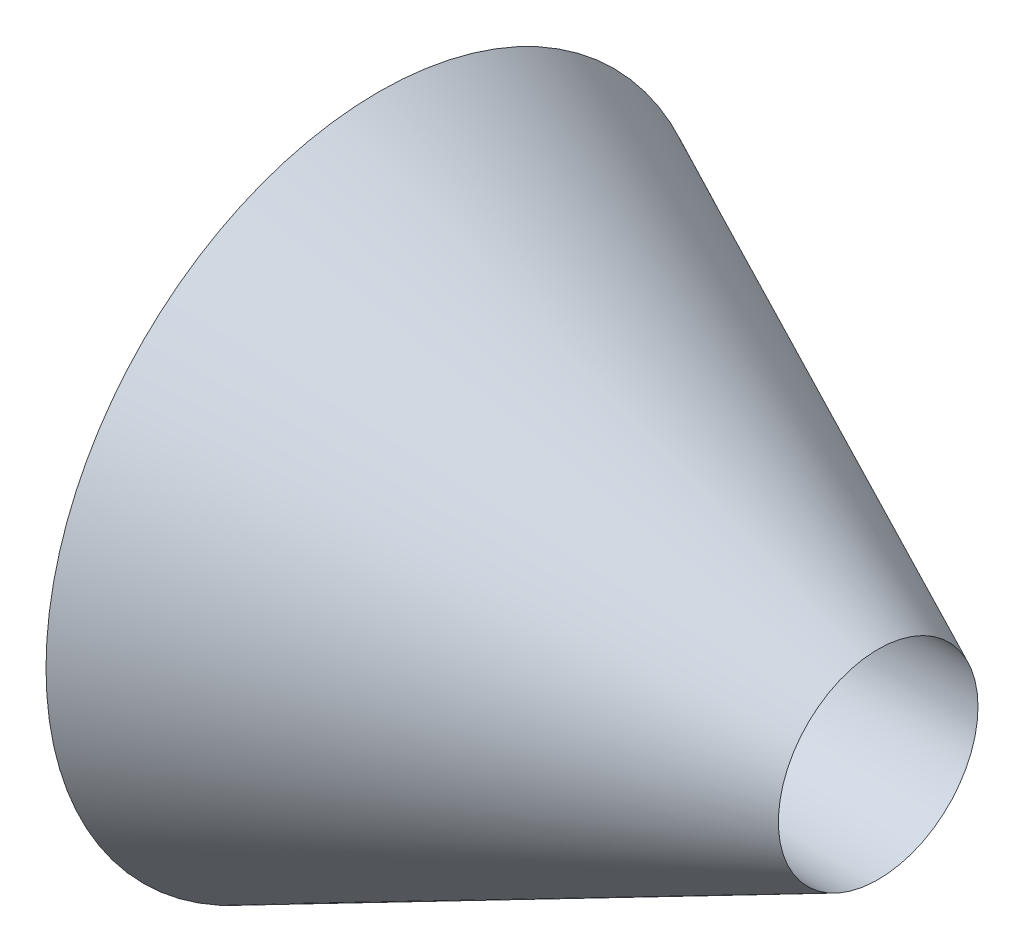
ISO-10303-21;
HEADER;
FILE_DESCRIPTION(('STEP AP214'),'2;1');
FILE_NAME('part.step','',(''),(''),'','','');
FILE_SCHEMA(('AUTOMOTIVE_DESIGN { 1 0 10303 214 1 1 1 1 }'));
ENDSEC;
DATA;
#1=APPLICATION_CONTEXT('core data for automotive mechanical design processes');
#2=APPLICATION_PROTOCOL_DEFINITION('international standard','automotive_design',2000,#1);
#3=PRODUCT_CONTEXT('',#1,'mechanical');
#4=PRODUCT('Part','Part','',(#3));
#5=PRODUCT_RELATED_PRODUCT_CATEGORY('part','',(#4));
#6=PRODUCT_DEFINITION_FORMATION('','',#4);
#7=PRODUCT_DEFINITION_CONTEXT('part definition',#1,'design');
#8=PRODUCT_DEFINITION('design','',#6,#7);
#9=PRODUCT_DEFINITION_SHAPE('','',#8);
#10=(LENGTH_UNIT() NAMED_UNIT(*) SI_UNIT(.MILLI.,.METRE.));
#11=(NAMED_UNIT(*) PLANE_ANGLE_UNIT() SI_UNIT($,.RADIAN.));
#12=(NAMED_UNIT(*) SI_UNIT($,.STERADIAN.) SOLID_ANGLE_UNIT());
#13=UNCERTAINTY_MEASURE_WITH_UNIT(LENGTH_MEASURE(1.E-05),#10,'distance_accuracy_value','');
#14=(GEOMETRIC_REPRESENTATION_CONTEXT(3) GLOBAL_UNCERTAINTY_ASSIGNED_CONTEXT((#13)) GLOBAL_UNIT_ASSIGNED_CONTEXT((#10,
#11,#12)) REPRESENTATION_CONTEXT('',''));
#15=CARTESIAN_POINT('',(0.,0.,0.));
#16=DIRECTION('',(0.,0.,1.));
#17=DIRECTION('',(1.,0.,0.));
#18=AXIS2_PLACEMENT_3D('',#15,#16,#17);
#19=CARTESIAN_POINT('',(0.,0.,0.));
#20=DIRECTION('',(-1.,0.,0.));
#21=DIRECTION('',(0.,0.,-1.));
#22=AXIS2_PLACEMENT_3D('',#19,#20,#21);
#23=CONICAL_SURFACE('',#22,5.,0.436332312998583);
#24=CARTESIAN_POINT('',(0.,0.,0.));
#25=DIRECTION('',(1.,0.,0.));
#26=DIRECTION('',(0.,0.,-1.));
#27=AXIS2_PLACEMENT_3D('',#24,#25,#26);
#28=CIRCLE('',#27,5.);
#29=CARTESIAN_POINT('',(0.,0.,-5.));
#30=VERTEX_POINT('',#29);
#31=EDGE_CURVE('E10',#30,#30,#28,.T.);
#32=CARTESIAN_POINT('',(7.50577422178344,0.,0.));
#33=DIRECTION('',(-1.,0.,0.));
#34=DIRECTION('',(0.,0.,1.));
#35=AXIS2_PLACEMENT_3D('',#32,#33,#34);
#36=CIRCLE('',#35,1.5);
#37=CARTESIAN_POINT('',(7.50577422178344,0.,-1.5));
#38=VERTEX_POINT('',#37);
#39=EDGE_CURVE('E50',#38,#38,#36,.F.);
#40=CARTESIAN_POINT('',(0.,0.,-5.));
#41=CARTESIAN_POINT('',(0.0781851481435776,0.,-4.96354166666667));
#42=CARTESIAN_POINT('',(0.156370296287155,0.,-4.92708333333333));
#43=CARTESIAN_POINT('',(0.31274059257431,0.,-4.85416666666667));
#44=CARTESIAN_POINT('',(0.390925740717887,0.,-4.81770833333333));
#45=CARTESIAN_POINT('',(0.547296037005042,0.,-4.74479166666667));
#46=CARTESIAN_POINT('',(0.62548118514862,0.,-4.70833333333333));
#47=CARTESIAN_POINT('',(0.781851481435775,0.,-4.63541666666667));
#48=CARTESIAN_POINT('',(0.860036629579352,0.,-4.59895833333333));
#49=CARTESIAN_POINT('',(1.01640692586651,0.,-4.52604166666667));
#50=CARTESIAN_POINT('',(1.09459207401008,0.,-4.48958333333333));
#51=CARTESIAN_POINT('',(1.25096237029724,0.,-4.41666666666667));
#52=CARTESIAN_POINT('',(1.32914751844082,0.,-4.38020833333333));
#53=CARTESIAN_POINT('',(1.48551781472797,0.,-4.30729166666667));
#54=CARTESIAN_POINT('',(1.56370296287155,0.,-4.27083333333333));
#55=CARTESIAN_POINT('',(1.7200732591587,0.,-4.19791666666667));
#56=CARTESIAN_POINT('',(1.79825840730228,0.,-4.16145833333333));
#57=CARTESIAN_POINT('',(1.95462870358944,0.,-4.08854166666667));
#58=CARTESIAN_POINT('',(2.03281385173301,0.,-4.05208333333333));
#59=CARTESIAN_POINT('',(2.18918414802017,0.,-3.97916666666667));
#60=CARTESIAN_POINT('',(2.26736929616375,0.,-3.94270833333333));
#61=CARTESIAN_POINT('',(2.4237395924509,0.,-3.86979166666667));
#62=CARTESIAN_POINT('',(2.50192474059448,0.,-3.83333333333333));
#63=CARTESIAN_POINT('',(2.65829503688163,0.,-3.76041666666667));
#64=CARTESIAN_POINT('',(2.73648018502521,0.,-3.72395833333333));
#65=CARTESIAN_POINT('',(2.89285048131237,0.,-3.65104166666667));
#66=CARTESIAN_POINT('',(2.97103562945594,0.,-3.61458333333333));
#67=CARTESIAN_POINT('',(3.1274059257431,0.,-3.54166666666667));
#68=CARTESIAN_POINT('',(3.20559107388668,0.,-3.50520833333333));
#69=CARTESIAN_POINT('',(3.36196137017383,0.,-3.43229166666667));
#70=CARTESIAN_POINT('',(3.44014651831741,0.,-3.39583333333333));
#71=CARTESIAN_POINT('',(3.59651681460456,0.,-3.32291666666667));
#72=CARTESIAN_POINT('',(3.67470196274814,0.,-3.28645833333333));
#73=CARTESIAN_POINT('',(3.8310722590353,0.,-3.21354166666667));
#74=CARTESIAN_POINT('',(3.90925740717887,0.,-3.17708333333333));
#75=CARTESIAN_POINT('',(4.06562770346603,0.,-3.10416666666667));
#76=CARTESIAN_POINT('',(4.14381285160961,0.,-3.06770833333333));
#77=CARTESIAN_POINT('',(4.30018314789676,0.,-2.99479166666667));
#78=CARTESIAN_POINT('',(4.37836829604034,0.,-2.95833333333333));
#79=CARTESIAN_POINT('',(4.53473859232749,0.,-2.88541666666667));
#80=CARTESIAN_POINT('',(4.61292374047107,0.,-2.84895833333333));
#81=CARTESIAN_POINT('',(4.76929403675823,0.,-2.77604166666667));
#82=CARTESIAN_POINT('',(4.8474791849018,0.,-2.73958333333333));
#83=CARTESIAN_POINT('',(5.00384948118896,0.,-2.66666666666667));
#84=CARTESIAN_POINT('',(5.08203462933253,0.,-2.63020833333333));
#85=CARTESIAN_POINT('',(5.23840492561969,0.,-2.55729166666667));
#86=CARTESIAN_POINT('',(5.31659007376327,0.,-2.52083333333333));
#87=CARTESIAN_POINT('',(5.47296037005042,0.,-2.44791666666667));
#88=CARTESIAN_POINT('',(5.551145518194,0.,-2.41145833333333));
#89=CARTESIAN_POINT('',(5.70751581448116,0.,-2.33854166666667));
#90=CARTESIAN_POINT('',(5.78570096262473,0.,-2.30208333333333));
#91=CARTESIAN_POINT('',(5.94207125891189,0.,-2.22916666666667));
#92=CARTESIAN_POINT('',(6.02025640705546,0.,-2.19270833333333));
#93=CARTESIAN_POINT('',(6.17662670334262,0.,-2.11979166666667));
#94=CARTESIAN_POINT('',(6.2548118514862,0.,-2.08333333333333));
#95=CARTESIAN_POINT('',(6.41118214777335,0.,-2.01041666666667));
#96=CARTESIAN_POINT('',(6.48936729591693,0.,-1.97395833333333));
#97=CARTESIAN_POINT('',(6.64573759220409,0.,-1.90104166666667));
#98=CARTESIAN_POINT('',(6.72392274034766,0.,-1.86458333333333));
#99=CARTESIAN_POINT('',(6.88029303663482,0.,-1.79166666666667));
#100=CARTESIAN_POINT('',(6.95847818477839,0.,-1.75520833333333));
#101=CARTESIAN_POINT('',(7.11484848106555,0.,-1.68229166666667));
#102=CARTESIAN_POINT('',(7.19303362920913,0.,-1.64583333333333));
#103=CARTESIAN_POINT('',(7.34940392549628,0.,-1.57291666666667));
#104=CARTESIAN_POINT('',(7.42758907363986,0.,-1.53645833333333));
#105=CARTESIAN_POINT('',(7.50577422178344,0.,-1.5));
#106=B_SPLINE_CURVE_WITH_KNOTS('',3,(#40,#41,#42,#43,#44,#45,#46,#47,#48,#49,#50,#51,#52,#53,
#54,#55,#56,#57,#58,#59,#60,#61,#62,#63,#64,#65,#66,#67,#68,#69,#70,#71,#72,#73,#74,#75,#76,#77,
#78,#79,#80,#81,#82,#83,#84,#85,#86,#87,#88,#89,#90,#91,#92,#93,#94,#95,#96,#97,#98,#99,#100,
#101,#102,#103,#104,#105),.UNSPECIFIED.,.F.,.F.,(4,2,2,2,2,2,2,2,2,2,2,2,2,2,2,2,2,2,2,2,2,2,2,
2,2,2,2,2,2,2,2,2,4),(0.,0.258803298157304,0.517606596314608,0.776409894471912,1.03521319262922,
1.29401649078652,1.55281978894382,1.81162308710113,2.07042638525843,2.32922968341574,
2.58803298157304,2.84683627973034,3.10563957788765,3.36444287604495,3.62324617420226,
3.88204947235956,4.14085277051686,4.39965606867417,4.65845936683147,4.91726266498878,
5.17606596314608,5.43486926130338,5.69367255946069,5.95247585761799,6.2112791557753,
6.4700824539326,6.72888575208991,6.98768905024721,7.24649234840451,7.50529564656182,
7.76409894471912,8.02290224287643,8.28170554103373),.UNSPECIFIED.);
#107=EDGE_CURVE('BSEAM43',#30,#38,#106,.T.);
#108=ORIENTED_EDGE('',*,*,#31,.T.);
#109=ORIENTED_EDGE('',*,*,#39,.F.);
#110=ORIENTED_EDGE('',*,*,#107,.T.);
#111=ORIENTED_EDGE('',*,*,#107,.F.);
#112=EDGE_LOOP('',(#108,#110,#109,#111));
#113=FACE_BOUND('',#112,.T.);
#114=ADVANCED_FACE('F43',(#113),#23,.T.);
#115=CARTESIAN_POINT('',(0.,0.,0.));
#116=DIRECTION('',(1.,0.,0.));
#117=DIRECTION('',(0.,0.,-1.));
#118=AXIS2_PLACEMENT_3D('',#115,#116,#117);
#119=PLANE('',#118);
#120=CARTESIAN_POINT('',(0.,0.,0.));
#121=DIRECTION('',(1.,0.,0.));
#122=DIRECTION('',(0.,0.,-1.));
#123=AXIS2_PLACEMENT_3D('',#120,#121,#122);
#124=CIRCLE('',#123,1.5);
#125=CARTESIAN_POINT('',(0.,0.,-1.5));
#126=VERTEX_POINT('',#125);
#127=EDGE_CURVE('E55',#126,#126,#124,.T.);
#128=ORIENTED_EDGE('',*,*,#127,.T.);
#129=EDGE_LOOP('',(#128));
#130=FACE_BOUND('',#129,.T.);
#131=ORIENTED_EDGE('',*,*,#31,.F.);
#132=EDGE_LOOP('',(#131));
#133=FACE_BOUND('',#132,.T.);
#134=ADVANCED_FACE('F63',(#130,#133),#119,.F.);
#135=CARTESIAN_POINT('',(15.,0.,0.));
#136=DIRECTION('',(-1.,0.,0.));
#137=DIRECTION('',(0.,0.,1.));
#138=AXIS2_PLACEMENT_3D('',#135,#136,#137);
#139=CYLINDRICAL_SURFACE('',#138,1.5);
#140=ORIENTED_EDGE('',*,*,#127,.F.);
#141=EDGE_LOOP('',(#140));
#142=FACE_BOUND('',#141,.T.);
#143=ORIENTED_EDGE('',*,*,#39,.T.);
#144=EDGE_LOOP('',(#143));
#145=FACE_BOUND('',#144,.T.);
#146=ADVANCED_FACE('F66',(#142,#145),#139,.F.);
#147=CLOSED_SHELL('',(#114,#134,#146));
#148=MANIFOLD_SOLID_BREP('B2',#147);
#149=ADVANCED_BREP_SHAPE_REPRESENTATION('',(#18,#148),#14);
#150=SHAPE_DEFINITION_REPRESENTATION(#9,#149);
ENDSEC;
END-ISO-10303-21;
